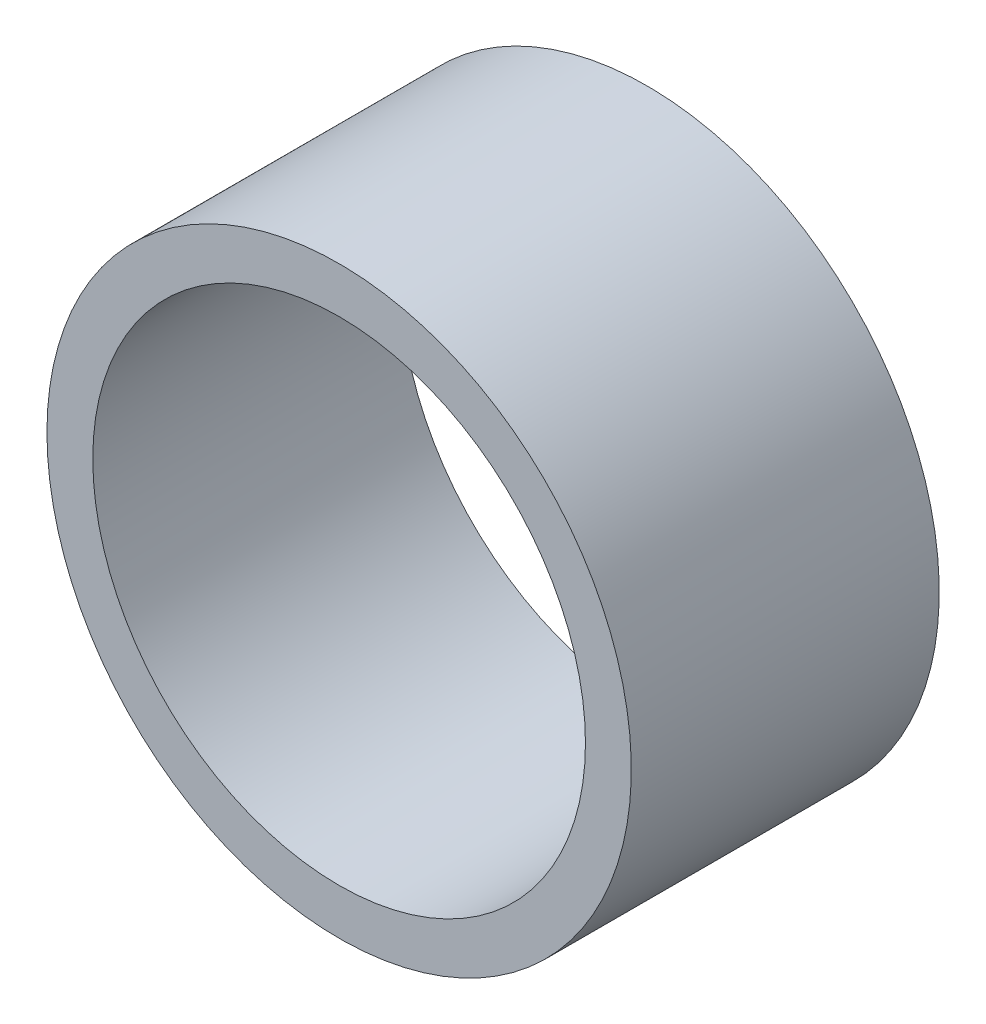
ISO-10303-21;
HEADER;
FILE_DESCRIPTION(('STEP AP214'),'2;1');
FILE_NAME('part.step','',(''),(''),'','','');
FILE_SCHEMA(('AUTOMOTIVE_DESIGN { 1 0 10303 214 1 1 1 1 }'));
ENDSEC;
DATA;
#1=APPLICATION_CONTEXT('core data for automotive mechanical design processes');
#2=APPLICATION_PROTOCOL_DEFINITION('international standard','automotive_design',2000,#1);
#3=PRODUCT_CONTEXT('',#1,'mechanical');
#4=PRODUCT('Part','Part','',(#3));
#5=PRODUCT_RELATED_PRODUCT_CATEGORY('part','',(#4));
#6=PRODUCT_DEFINITION_FORMATION('','',#4);
#7=PRODUCT_DEFINITION_CONTEXT('part definition',#1,'design');
#8=PRODUCT_DEFINITION('design','',#6,#7);
#9=PRODUCT_DEFINITION_SHAPE('','',#8);
#10=(LENGTH_UNIT() NAMED_UNIT(*) SI_UNIT(.MILLI.,.METRE.));
#11=(NAMED_UNIT(*) PLANE_ANGLE_UNIT() SI_UNIT($,.RADIAN.));
#12=(NAMED_UNIT(*) SI_UNIT($,.STERADIAN.) SOLID_ANGLE_UNIT());
#13=UNCERTAINTY_MEASURE_WITH_UNIT(LENGTH_MEASURE(1.E-05),#10,'distance_accuracy_value','');
#14=(GEOMETRIC_REPRESENTATION_CONTEXT(3) GLOBAL_UNCERTAINTY_ASSIGNED_CONTEXT((#13)) GLOBAL_UNIT_ASSIGNED_CONTEXT((#10,
#11,#12)) REPRESENTATION_CONTEXT('',''));
#15=CARTESIAN_POINT('',(0.,0.,0.));
#16=DIRECTION('',(0.,0.,1.));
#17=DIRECTION('',(1.,0.,0.));
#18=AXIS2_PLACEMENT_3D('',#15,#16,#17);
#19=CARTESIAN_POINT('',(0.,0.,0.));
#20=DIRECTION('',(0.,0.,-1.));
#21=DIRECTION('',(-1.,0.,0.));
#22=AXIS2_PLACEMENT_3D('',#19,#20,#21);
#23=CYLINDRICAL_SURFACE('',#22,20.875);
#24=CARTESIAN_POINT('',(0.,0.,22.));
#25=DIRECTION('',(0.,0.,-1.));
#26=DIRECTION('',(-1.,0.,0.));
#27=AXIS2_PLACEMENT_3D('',#24,#25,#26);
#28=CIRCLE('',#27,20.875);
#29=CARTESIAN_POINT('',(-20.875,0.,22.));
#30=VERTEX_POINT('',#29);
#31=EDGE_CURVE('E10',#30,#30,#28,.T.);
#32=ORIENTED_EDGE('',*,*,#31,.T.);
#33=EDGE_LOOP('',(#32));
#34=FACE_BOUND('',#33,.T.);
#35=CARTESIAN_POINT('',(0.,0.,0.));
#36=DIRECTION('',(0.,0.,-1.));
#37=DIRECTION('',(-1.,0.,0.));
#38=AXIS2_PLACEMENT_3D('',#35,#36,#37);
#39=CIRCLE('',#38,20.875);
#40=CARTESIAN_POINT('',(-20.875,0.,0.));
#41=VERTEX_POINT('',#40);
#42=EDGE_CURVE('E45',#41,#41,#39,.T.);
#43=ORIENTED_EDGE('',*,*,#42,.F.);
#44=EDGE_LOOP('',(#43));
#45=FACE_BOUND('',#44,.T.);
#46=ADVANCED_FACE('F31',(#34,#45),#23,.T.);
#47=CARTESIAN_POINT('',(0.,20.875,22.));
#48=DIRECTION('',(0.,0.,1.));
#49=DIRECTION('',(1.,0.,0.));
#50=AXIS2_PLACEMENT_3D('',#47,#48,#49);
#51=PLANE('',#50);
#52=CARTESIAN_POINT('',(0.,0.,22.));
#53=DIRECTION('',(0.,0.,-1.));
#54=DIRECTION('',(-1.,0.,0.));
#55=AXIS2_PLACEMENT_3D('',#52,#53,#54);
#56=CIRCLE('',#55,17.6);
#57=CARTESIAN_POINT('',(-17.6,0.,22.));
#58=VERTEX_POINT('',#57);
#59=EDGE_CURVE('E37',#58,#58,#56,.T.);
#60=ORIENTED_EDGE('',*,*,#59,.T.);
#61=EDGE_LOOP('',(#60));
#62=FACE_BOUND('',#61,.T.);
#63=ORIENTED_EDGE('',*,*,#31,.F.);
#64=EDGE_LOOP('',(#63));
#65=FACE_BOUND('',#64,.T.);
#66=ADVANCED_FACE('F55',(#62,#65),#51,.T.);
#67=CARTESIAN_POINT('',(0.,0.,0.));
#68=DIRECTION('',(0.,0.,-1.));
#69=DIRECTION('',(-1.,0.,0.));
#70=AXIS2_PLACEMENT_3D('',#67,#68,#69);
#71=CYLINDRICAL_SURFACE('',#70,17.6);
#72=CARTESIAN_POINT('',(0.,0.,0.));
#73=DIRECTION('',(0.,0.,-1.));
#74=DIRECTION('',(-1.,0.,0.));
#75=AXIS2_PLACEMENT_3D('',#72,#73,#74);
#76=CIRCLE('',#75,17.6);
#77=CARTESIAN_POINT('',(-17.6,0.,0.));
#78=VERTEX_POINT('',#77);
#79=EDGE_CURVE('E41',#78,#78,#76,.T.);
#80=ORIENTED_EDGE('',*,*,#79,.T.);
#81=EDGE_LOOP('',(#80));
#82=FACE_BOUND('',#81,.T.);
#83=ORIENTED_EDGE('',*,*,#59,.F.);
#84=EDGE_LOOP('',(#83));
#85=FACE_BOUND('',#84,.T.);
#86=ADVANCED_FACE('F59',(#82,#85),#71,.F.);
#87=CARTESIAN_POINT('',(0.,17.6,0.));
#88=DIRECTION('',(0.,0.,-1.));
#89=DIRECTION('',(-1.,0.,0.));
#90=AXIS2_PLACEMENT_3D('',#87,#88,#89);
#91=PLANE('',#90);
#92=ORIENTED_EDGE('',*,*,#42,.T.);
#93=EDGE_LOOP('',(#92));
#94=FACE_BOUND('',#93,.T.);
#95=ORIENTED_EDGE('',*,*,#79,.F.);
#96=EDGE_LOOP('',(#95));
#97=FACE_BOUND('',#96,.T.);
#98=ADVANCED_FACE('F51',(#94,#97),#91,.T.);
#99=CLOSED_SHELL('',(#46,#66,#86,#98));
#100=MANIFOLD_SOLID_BREP('B2',#99);
#101=ADVANCED_BREP_SHAPE_REPRESENTATION('',(#18,#100),#14);
#102=SHAPE_DEFINITION_REPRESENTATION(#9,#101);
ENDSEC;
END-ISO-10303-21;
